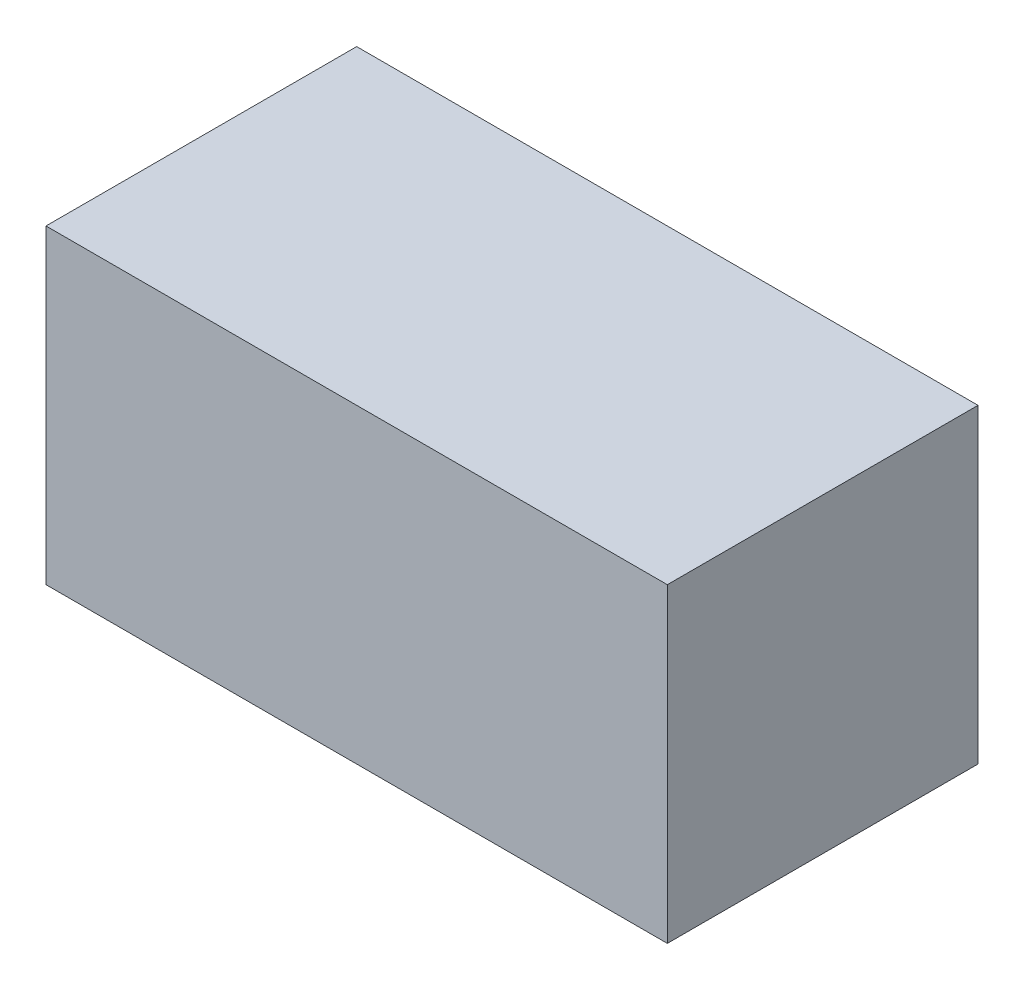
ISO-10303-21;
HEADER;
FILE_DESCRIPTION(('STEP AP214'),'2;1');
FILE_NAME('part.step','',(''),(''),'','','');
FILE_SCHEMA(('AUTOMOTIVE_DESIGN { 1 0 10303 214 1 1 1 1 }'));
ENDSEC;
DATA;
#1=APPLICATION_CONTEXT('core data for automotive mechanical design processes');
#2=APPLICATION_PROTOCOL_DEFINITION('international standard','automotive_design',2000,#1);
#3=PRODUCT_CONTEXT('',#1,'mechanical');
#4=PRODUCT('Part','Part','',(#3));
#5=PRODUCT_RELATED_PRODUCT_CATEGORY('part','',(#4));
#6=PRODUCT_DEFINITION_FORMATION('','',#4);
#7=PRODUCT_DEFINITION_CONTEXT('part definition',#1,'design');
#8=PRODUCT_DEFINITION('design','',#6,#7);
#9=PRODUCT_DEFINITION_SHAPE('','',#8);
#10=(LENGTH_UNIT() NAMED_UNIT(*) SI_UNIT(.MILLI.,.METRE.));
#11=(NAMED_UNIT(*) PLANE_ANGLE_UNIT() SI_UNIT($,.RADIAN.));
#12=(NAMED_UNIT(*) SI_UNIT($,.STERADIAN.) SOLID_ANGLE_UNIT());
#13=UNCERTAINTY_MEASURE_WITH_UNIT(LENGTH_MEASURE(1.E-05),#10,'distance_accuracy_value','');
#14=(GEOMETRIC_REPRESENTATION_CONTEXT(3) GLOBAL_UNCERTAINTY_ASSIGNED_CONTEXT((#13)) GLOBAL_UNIT_ASSIGNED_CONTEXT((#10,
#11,#12)) REPRESENTATION_CONTEXT('',''));
#15=CARTESIAN_POINT('',(0.,0.,0.));
#16=DIRECTION('',(0.,0.,1.));
#17=DIRECTION('',(1.,0.,0.));
#18=AXIS2_PLACEMENT_3D('',#15,#16,#17);
#19=CARTESIAN_POINT('',(10.,-5.,10.));
#20=DIRECTION('',(-1.,0.,0.));
#21=DIRECTION('',(0.,0.,1.));
#22=AXIS2_PLACEMENT_3D('',#19,#20,#21);
#23=PLANE('',#22);
#24=DIRECTION('',(0.,1.,0.));
#25=VECTOR('',#24,1.);
#26=CARTESIAN_POINT('',(10.,-5.,0.));
#27=LINE('',#26,#25);
#28=CARTESIAN_POINT('',(10.,-5.,0.));
#29=VERTEX_POINT('',#28);
#30=CARTESIAN_POINT('',(10.,5.,0.));
#31=VERTEX_POINT('',#30);
#32=EDGE_CURVE('E107',#29,#31,#27,.T.);
#33=ORIENTED_EDGE('',*,*,#32,.T.);
#34=DIRECTION('',(0.,0.,-1.));
#35=VECTOR('',#34,1.);
#36=CARTESIAN_POINT('',(10.,5.,10.));
#37=LINE('',#36,#35);
#38=CARTESIAN_POINT('',(10.,5.,10.));
#39=VERTEX_POINT('',#38);
#40=EDGE_CURVE('E11',#39,#31,#37,.T.);
#41=ORIENTED_EDGE('',*,*,#40,.F.);
#42=DIRECTION('',(0.,1.,0.));
#43=VECTOR('',#42,1.);
#44=CARTESIAN_POINT('',(10.,-5.,10.));
#45=LINE('',#44,#43);
#46=CARTESIAN_POINT('',(10.,-5.,10.));
#47=VERTEX_POINT('',#46);
#48=EDGE_CURVE('E91',#47,#39,#45,.T.);
#49=ORIENTED_EDGE('',*,*,#48,.F.);
#50=DIRECTION('',(0.,0.,-1.));
#51=VECTOR('',#50,1.);
#52=CARTESIAN_POINT('',(10.,-5.,10.));
#53=LINE('',#52,#51);
#54=EDGE_CURVE('E103',#47,#29,#53,.T.);
#55=ORIENTED_EDGE('',*,*,#54,.T.);
#56=EDGE_LOOP('',(#33,#41,#49,#55));
#57=FACE_BOUND('',#56,.T.);
#58=ADVANCED_FACE('F39',(#57),#23,.F.);
#59=CARTESIAN_POINT('',(-10.,5.,10.));
#60=DIRECTION('',(0.,-1.,0.));
#61=DIRECTION('',(0.,0.,-1.));
#62=AXIS2_PLACEMENT_3D('',#59,#60,#61);
#63=PLANE('',#62);
#64=DIRECTION('',(-1.,0.,0.));
#65=VECTOR('',#64,1.);
#66=CARTESIAN_POINT('',(-10.,5.,0.));
#67=LINE('',#66,#65);
#68=CARTESIAN_POINT('',(-10.,5.,0.));
#69=VERTEX_POINT('',#68);
#70=EDGE_CURVE('E96',#31,#69,#67,.T.);
#71=ORIENTED_EDGE('',*,*,#70,.T.);
#72=DIRECTION('',(0.,0.,-1.));
#73=VECTOR('',#72,1.);
#74=CARTESIAN_POINT('',(-10.,5.,10.));
#75=LINE('',#74,#73);
#76=CARTESIAN_POINT('',(-10.,5.,10.));
#77=VERTEX_POINT('',#76);
#78=EDGE_CURVE('E48',#77,#69,#75,.T.);
#79=ORIENTED_EDGE('',*,*,#78,.F.);
#80=DIRECTION('',(-1.,0.,0.));
#81=VECTOR('',#80,1.);
#82=CARTESIAN_POINT('',(-10.,5.,10.));
#83=LINE('',#82,#81);
#84=EDGE_CURVE('E86',#39,#77,#83,.T.);
#85=ORIENTED_EDGE('',*,*,#84,.F.);
#86=ORIENTED_EDGE('',*,*,#40,.T.);
#87=EDGE_LOOP('',(#71,#79,#85,#86));
#88=FACE_BOUND('',#87,.T.);
#89=ADVANCED_FACE('F95',(#88),#63,.F.);
#90=CARTESIAN_POINT('',(-10.,-5.,10.));
#91=DIRECTION('',(1.,0.,0.));
#92=DIRECTION('',(0.,0.,-1.));
#93=AXIS2_PLACEMENT_3D('',#90,#91,#92);
#94=PLANE('',#93);
#95=DIRECTION('',(0.,-1.,0.));
#96=VECTOR('',#95,1.);
#97=CARTESIAN_POINT('',(-10.,-5.,0.));
#98=LINE('',#97,#96);
#99=CARTESIAN_POINT('',(-10.,-5.,0.));
#100=VERTEX_POINT('',#99);
#101=EDGE_CURVE('E73',#69,#100,#98,.T.);
#102=ORIENTED_EDGE('',*,*,#101,.T.);
#103=DIRECTION('',(0.,0.,-1.));
#104=VECTOR('',#103,1.);
#105=CARTESIAN_POINT('',(-10.,-5.,10.));
#106=LINE('',#105,#104);
#107=CARTESIAN_POINT('',(-10.,-5.,10.));
#108=VERTEX_POINT('',#107);
#109=EDGE_CURVE('E98',#108,#100,#106,.T.);
#110=ORIENTED_EDGE('',*,*,#109,.F.);
#111=DIRECTION('',(0.,-1.,0.));
#112=VECTOR('',#111,1.);
#113=CARTESIAN_POINT('',(-10.,-5.,10.));
#114=LINE('',#113,#112);
#115=EDGE_CURVE('E89',#77,#108,#114,.T.);
#116=ORIENTED_EDGE('',*,*,#115,.F.);
#117=ORIENTED_EDGE('',*,*,#78,.T.);
#118=EDGE_LOOP('',(#102,#110,#116,#117));
#119=FACE_BOUND('',#118,.T.);
#120=ADVANCED_FACE('F99',(#119),#94,.F.);
#121=CARTESIAN_POINT('',(-10.,-5.,10.));
#122=DIRECTION('',(0.,1.,0.));
#123=DIRECTION('',(0.,0.,1.));
#124=AXIS2_PLACEMENT_3D('',#121,#122,#123);
#125=PLANE('',#124);
#126=DIRECTION('',(1.,0.,0.));
#127=VECTOR('',#126,1.);
#128=CARTESIAN_POINT('',(-10.,-5.,0.));
#129=LINE('',#128,#127);
#130=EDGE_CURVE('E79',#100,#29,#129,.T.);
#131=ORIENTED_EDGE('',*,*,#130,.T.);
#132=ORIENTED_EDGE('',*,*,#54,.F.);
#133=DIRECTION('',(1.,0.,0.));
#134=VECTOR('',#133,1.);
#135=CARTESIAN_POINT('',(-10.,-5.,10.));
#136=LINE('',#135,#134);
#137=EDGE_CURVE('E56',#108,#47,#136,.T.);
#138=ORIENTED_EDGE('',*,*,#137,.F.);
#139=ORIENTED_EDGE('',*,*,#109,.T.);
#140=EDGE_LOOP('',(#131,#132,#138,#139));
#141=FACE_BOUND('',#140,.T.);
#142=ADVANCED_FACE('F120',(#141),#125,.F.);
#143=CARTESIAN_POINT('',(0.,0.,10.));
#144=DIRECTION('',(0.,0.,-1.));
#145=DIRECTION('',(-1.,0.,0.));
#146=AXIS2_PLACEMENT_3D('',#143,#144,#145);
#147=PLANE('',#146);
#148=ORIENTED_EDGE('',*,*,#48,.T.);
#149=ORIENTED_EDGE('',*,*,#84,.T.);
#150=ORIENTED_EDGE('',*,*,#115,.T.);
#151=ORIENTED_EDGE('',*,*,#137,.T.);
#152=EDGE_LOOP('',(#148,#149,#150,#151));
#153=FACE_BOUND('',#152,.T.);
#154=ADVANCED_FACE('F87',(#153),#147,.F.);
#155=CARTESIAN_POINT('',(0.,0.,0.));
#156=DIRECTION('',(0.,0.,-1.));
#157=DIRECTION('',(-1.,0.,0.));
#158=AXIS2_PLACEMENT_3D('',#155,#156,#157);
#159=PLANE('',#158);
#160=ORIENTED_EDGE('',*,*,#32,.F.);
#161=ORIENTED_EDGE('',*,*,#130,.F.);
#162=ORIENTED_EDGE('',*,*,#101,.F.);
#163=ORIENTED_EDGE('',*,*,#70,.F.);
#164=EDGE_LOOP('',(#160,#161,#162,#163));
#165=FACE_BOUND('',#164,.T.);
#166=ADVANCED_FACE('F123',(#165),#159,.T.);
#167=CLOSED_SHELL('',(#58,#89,#120,#142,#154,#166));
#168=MANIFOLD_SOLID_BREP('B2',#167);
#169=ADVANCED_BREP_SHAPE_REPRESENTATION('',(#18,#168),#14);
#170=SHAPE_DEFINITION_REPRESENTATION(#9,#169);
ENDSEC;
END-ISO-10303-21;
